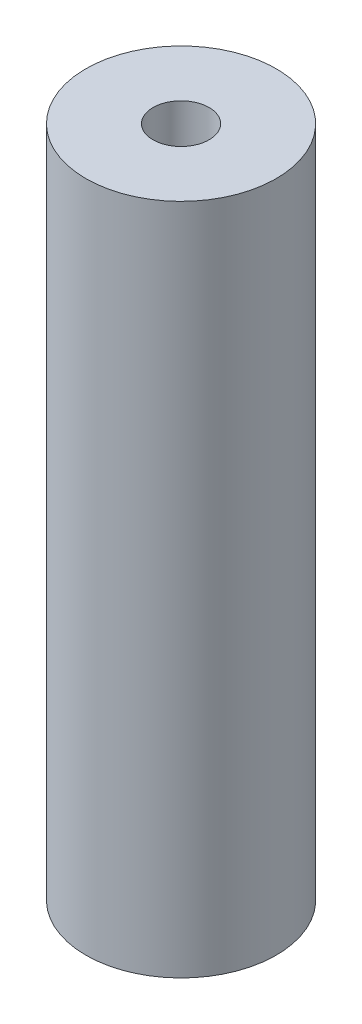
ISO-10303-21;
HEADER;
FILE_DESCRIPTION(('STEP AP214'),'2;1');
FILE_NAME('part.step','',(''),(''),'','','');
FILE_SCHEMA(('AUTOMOTIVE_DESIGN { 1 0 10303 214 1 1 1 1 }'));
ENDSEC;
DATA;
#1=APPLICATION_CONTEXT('core data for automotive mechanical design processes');
#2=APPLICATION_PROTOCOL_DEFINITION('international standard','automotive_design',2000,#1);
#3=PRODUCT_CONTEXT('',#1,'mechanical');
#4=PRODUCT('Part','Part','',(#3));
#5=PRODUCT_RELATED_PRODUCT_CATEGORY('part','',(#4));
#6=PRODUCT_DEFINITION_FORMATION('','',#4);
#7=PRODUCT_DEFINITION_CONTEXT('part definition',#1,'design');
#8=PRODUCT_DEFINITION('design','',#6,#7);
#9=PRODUCT_DEFINITION_SHAPE('','',#8);
#10=(LENGTH_UNIT() NAMED_UNIT(*) SI_UNIT(.MILLI.,.METRE.));
#11=(NAMED_UNIT(*) PLANE_ANGLE_UNIT() SI_UNIT($,.RADIAN.));
#12=(NAMED_UNIT(*) SI_UNIT($,.STERADIAN.) SOLID_ANGLE_UNIT());
#13=UNCERTAINTY_MEASURE_WITH_UNIT(LENGTH_MEASURE(1.E-05),#10,'distance_accuracy_value','');
#14=(GEOMETRIC_REPRESENTATION_CONTEXT(3) GLOBAL_UNCERTAINTY_ASSIGNED_CONTEXT((#13)) GLOBAL_UNIT_ASSIGNED_CONTEXT((#10,
#11,#12)) REPRESENTATION_CONTEXT('',''));
#15=CARTESIAN_POINT('',(0.,0.,0.));
#16=DIRECTION('',(0.,0.,1.));
#17=DIRECTION('',(1.,0.,0.));
#18=AXIS2_PLACEMENT_3D('',#15,#16,#17);
#19=CARTESIAN_POINT('',(0.,457.2,0.));
#20=DIRECTION('',(0.,1.,0.));
#21=DIRECTION('',(0.,0.,1.));
#22=AXIS2_PLACEMENT_3D('',#19,#20,#21);
#23=PLANE('',#22);
#24=CARTESIAN_POINT('',(0.,457.2,0.));
#25=DIRECTION('',(0.,1.,0.));
#26=DIRECTION('',(0.,0.,1.));
#27=AXIS2_PLACEMENT_3D('',#24,#25,#26);
#28=CIRCLE('',#27,64.7065);
#29=CARTESIAN_POINT('',(0.,457.2,64.7065));
#30=VERTEX_POINT('',#29);
#31=EDGE_CURVE('E10',#30,#30,#28,.T.);
#32=ORIENTED_EDGE('',*,*,#31,.T.);
#33=EDGE_LOOP('',(#32));
#34=FACE_BOUND('',#33,.T.);
#35=CARTESIAN_POINT('',(0.,457.2,0.));
#36=DIRECTION('',(0.,1.,0.));
#37=DIRECTION('',(0.,0.,1.));
#38=AXIS2_PLACEMENT_3D('',#35,#36,#37);
#39=CIRCLE('',#38,19.05);
#40=CARTESIAN_POINT('',(0.,457.2,19.05));
#41=VERTEX_POINT('',#40);
#42=EDGE_CURVE('E54',#41,#41,#39,.T.);
#43=ORIENTED_EDGE('',*,*,#42,.F.);
#44=EDGE_LOOP('',(#43));
#45=FACE_BOUND('',#44,.T.);
#46=ADVANCED_FACE('F40',(#34,#45),#23,.T.);
#47=CARTESIAN_POINT('',(0.,0.,0.));
#48=DIRECTION('',(0.,1.,0.));
#49=DIRECTION('',(0.,0.,1.));
#50=AXIS2_PLACEMENT_3D('',#47,#48,#49);
#51=PLANE('',#50);
#52=CARTESIAN_POINT('',(0.,0.,0.));
#53=DIRECTION('',(0.,1.,0.));
#54=DIRECTION('',(0.,0.,1.));
#55=AXIS2_PLACEMENT_3D('',#52,#53,#54);
#56=CIRCLE('',#55,64.7065);
#57=CARTESIAN_POINT('',(0.,0.,64.7065));
#58=VERTEX_POINT('',#57);
#59=EDGE_CURVE('E44',#58,#58,#56,.T.);
#60=ORIENTED_EDGE('',*,*,#59,.F.);
#61=EDGE_LOOP('',(#60));
#62=FACE_BOUND('',#61,.T.);
#63=CARTESIAN_POINT('',(0.,0.,0.));
#64=DIRECTION('',(0.,1.,0.));
#65=DIRECTION('',(0.,0.,1.));
#66=AXIS2_PLACEMENT_3D('',#63,#64,#65);
#67=CIRCLE('',#66,19.05);
#68=CARTESIAN_POINT('',(0.,0.,19.05));
#69=VERTEX_POINT('',#68);
#70=EDGE_CURVE('E56',#69,#69,#67,.T.);
#71=ORIENTED_EDGE('',*,*,#70,.T.);
#72=EDGE_LOOP('',(#71));
#73=FACE_BOUND('',#72,.T.);
#74=ADVANCED_FACE('F67',(#62,#73),#51,.F.);
#75=CARTESIAN_POINT('',(0.,457.2,0.));
#76=DIRECTION('',(0.,-1.,0.));
#77=DIRECTION('',(0.,0.,-1.));
#78=AXIS2_PLACEMENT_3D('',#75,#76,#77);
#79=CYLINDRICAL_SURFACE('',#78,64.7065);
#80=ORIENTED_EDGE('',*,*,#31,.F.);
#81=EDGE_LOOP('',(#80));
#82=FACE_BOUND('',#81,.T.);
#83=ORIENTED_EDGE('',*,*,#59,.T.);
#84=EDGE_LOOP('',(#83));
#85=FACE_BOUND('',#84,.T.);
#86=ADVANCED_FACE('F42',(#82,#85),#79,.T.);
#87=CARTESIAN_POINT('',(0.,457.2,0.));
#88=DIRECTION('',(0.,-1.,0.));
#89=DIRECTION('',(0.,0.,-1.));
#90=AXIS2_PLACEMENT_3D('',#87,#88,#89);
#91=CYLINDRICAL_SURFACE('',#90,19.05);
#92=ORIENTED_EDGE('',*,*,#42,.T.);
#93=EDGE_LOOP('',(#92));
#94=FACE_BOUND('',#93,.T.);
#95=ORIENTED_EDGE('',*,*,#70,.F.);
#96=EDGE_LOOP('',(#95));
#97=FACE_BOUND('',#96,.T.);
#98=ADVANCED_FACE('F63',(#94,#97),#91,.F.);
#99=CLOSED_SHELL('',(#46,#74,#86,#98));
#100=MANIFOLD_SOLID_BREP('B2',#99);
#101=ADVANCED_BREP_SHAPE_REPRESENTATION('',(#18,#100),#14);
#102=SHAPE_DEFINITION_REPRESENTATION(#9,#101);
ENDSEC;
END-ISO-10303-21;
